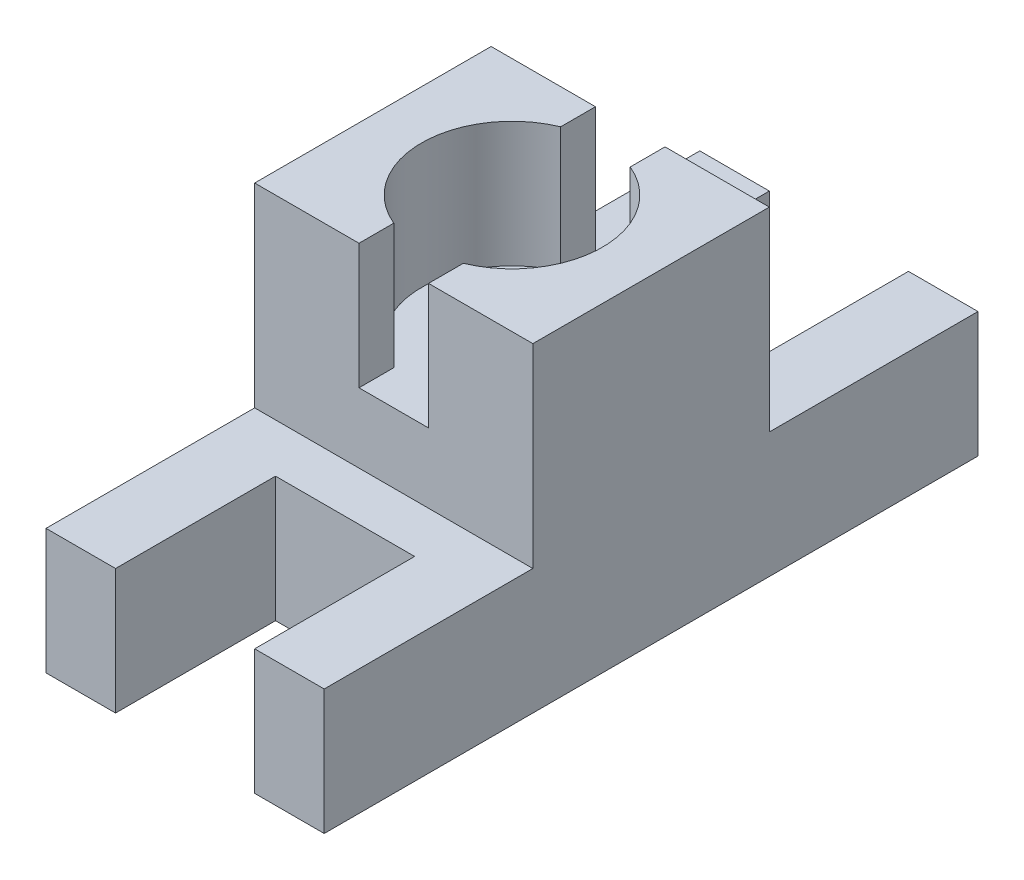
ISO-10303-21;
HEADER;
FILE_DESCRIPTION(('STEP AP214'),'2;1');
FILE_NAME('part.step','',(''),(''),'','','');
FILE_SCHEMA(('AUTOMOTIVE_DESIGN { 1 0 10303 214 1 1 1 1 }'));
ENDSEC;
DATA;
#1=APPLICATION_CONTEXT('core data for automotive mechanical design processes');
#2=APPLICATION_PROTOCOL_DEFINITION('international standard','automotive_design',2000,#1);
#3=PRODUCT_CONTEXT('',#1,'mechanical');
#4=PRODUCT('Part','Part','',(#3));
#5=PRODUCT_RELATED_PRODUCT_CATEGORY('part','',(#4));
#6=PRODUCT_DEFINITION_FORMATION('','',#4);
#7=PRODUCT_DEFINITION_CONTEXT('part definition',#1,'design');
#8=PRODUCT_DEFINITION('design','',#6,#7);
#9=PRODUCT_DEFINITION_SHAPE('','',#8);
#10=(LENGTH_UNIT() NAMED_UNIT(*) SI_UNIT(.MILLI.,.METRE.));
#11=(NAMED_UNIT(*) PLANE_ANGLE_UNIT() SI_UNIT($,.RADIAN.));
#12=(NAMED_UNIT(*) SI_UNIT($,.STERADIAN.) SOLID_ANGLE_UNIT());
#13=UNCERTAINTY_MEASURE_WITH_UNIT(LENGTH_MEASURE(1.E-05),#10,'distance_accuracy_value','');
#14=(GEOMETRIC_REPRESENTATION_CONTEXT(3) GLOBAL_UNCERTAINTY_ASSIGNED_CONTEXT((#13)) GLOBAL_UNIT_ASSIGNED_CONTEXT((#10,
#11,#12)) REPRESENTATION_CONTEXT('',''));
#15=CARTESIAN_POINT('',(0.,0.,0.));
#16=DIRECTION('',(0.,0.,1.));
#17=DIRECTION('',(1.,0.,0.));
#18=AXIS2_PLACEMENT_3D('',#15,#16,#17);
#19=CARTESIAN_POINT('',(-40.,37.,17.));
#20=DIRECTION('',(0.,1.,0.));
#21=DIRECTION('',(0.,0.,1.));
#22=AXIS2_PLACEMENT_3D('',#19,#20,#21);
#23=PLANE('',#22);
#24=DIRECTION('',(0.,0.,-1.));
#25=VECTOR('',#24,1.);
#26=CARTESIAN_POINT('',(-15.,37.,-17.));
#27=LINE('',#26,#25);
#28=CARTESIAN_POINT('',(-15.,37.,-12.));
#29=VERTEX_POINT('',#28);
#30=CARTESIAN_POINT('',(-15.,37.,-17.));
#31=VERTEX_POINT('',#30);
#32=EDGE_CURVE('E226',#29,#31,#27,.T.);
#33=ORIENTED_EDGE('',*,*,#32,.F.);
#34=CARTESIAN_POINT('',(-20.,37.,0.));
#35=DIRECTION('',(0.,1.,0.));
#36=DIRECTION('',(0.,0.,1.));
#37=AXIS2_PLACEMENT_3D('',#34,#35,#36);
#38=CIRCLE('',#37,13.);
#39=CARTESIAN_POINT('',(-15.,37.,12.));
#40=VERTEX_POINT('',#39);
#41=EDGE_CURVE('E228',#40,#29,#38,.T.);
#42=ORIENTED_EDGE('',*,*,#41,.F.);
#43=DIRECTION('',(0.,0.,-1.));
#44=VECTOR('',#43,1.);
#45=CARTESIAN_POINT('',(-15.,37.,12.));
#46=LINE('',#45,#44);
#47=CARTESIAN_POINT('',(-15.,37.,17.));
#48=VERTEX_POINT('',#47);
#49=EDGE_CURVE('E247',#48,#40,#46,.T.);
#50=ORIENTED_EDGE('',*,*,#49,.F.);
#51=DIRECTION('',(1.,0.,0.));
#52=VECTOR('',#51,1.);
#53=CARTESIAN_POINT('',(-40.,37.,17.));
#54=LINE('',#53,#52);
#55=CARTESIAN_POINT('',(0.,37.,17.));
#56=VERTEX_POINT('',#55);
#57=EDGE_CURVE('E371',#48,#56,#54,.T.);
#58=ORIENTED_EDGE('',*,*,#57,.T.);
#59=DIRECTION('',(0.,0.,1.));
#60=VECTOR('',#59,1.);
#61=CARTESIAN_POINT('',(0.,37.,17.));
#62=LINE('',#61,#60);
#63=CARTESIAN_POINT('',(0.,37.,-17.));
#64=VERTEX_POINT('',#63);
#65=EDGE_CURVE('E358',#64,#56,#62,.T.);
#66=ORIENTED_EDGE('',*,*,#65,.F.);
#67=DIRECTION('',(1.,0.,0.));
#68=VECTOR('',#67,1.);
#69=CARTESIAN_POINT('',(-40.,37.,-17.));
#70=LINE('',#69,#68);
#71=EDGE_CURVE('E375',#31,#64,#70,.T.);
#72=ORIENTED_EDGE('',*,*,#71,.F.);
#73=EDGE_LOOP('',(#33,#42,#50,#58,#66,#72));
#74=FACE_BOUND('',#73,.T.);
#75=ADVANCED_FACE('F39',(#74),#23,.T.);
#76=CARTESIAN_POINT('',(-40.,9.,47.));
#77=DIRECTION('',(0.,0.,1.));
#78=DIRECTION('',(1.,0.,0.));
#79=AXIS2_PLACEMENT_3D('',#76,#77,#78);
#80=PLANE('',#79);
#81=DIRECTION('',(0.,1.,0.));
#82=VECTOR('',#81,1.);
#83=CARTESIAN_POINT('',(-9.99999999999999,-9.00000000000001,47.));
#84=LINE('',#83,#82);
#85=CARTESIAN_POINT('',(-9.99999999999999,-9.00000000000001,47.));
#86=VERTEX_POINT('',#85);
#87=CARTESIAN_POINT('',(-9.99999999999999,9.,47.));
#88=VERTEX_POINT('',#87);
#89=EDGE_CURVE('E254',#86,#88,#84,.T.);
#90=ORIENTED_EDGE('',*,*,#89,.F.);
#91=DIRECTION('',(1.,0.,0.));
#92=VECTOR('',#91,1.);
#93=CARTESIAN_POINT('',(-40.,-9.,47.));
#94=LINE('',#93,#92);
#95=CARTESIAN_POINT('',(0.,-9.,47.));
#96=VERTEX_POINT('',#95);
#97=EDGE_CURVE('E343',#86,#96,#94,.T.);
#98=ORIENTED_EDGE('',*,*,#97,.T.);
#99=DIRECTION('',(0.,-1.,0.));
#100=VECTOR('',#99,1.);
#101=CARTESIAN_POINT('',(0.,9.,47.));
#102=LINE('',#101,#100);
#103=CARTESIAN_POINT('',(0.,9.,47.));
#104=VERTEX_POINT('',#103);
#105=EDGE_CURVE('E287',#104,#96,#102,.T.);
#106=ORIENTED_EDGE('',*,*,#105,.F.);
#107=DIRECTION('',(1.,0.,0.));
#108=VECTOR('',#107,1.);
#109=CARTESIAN_POINT('',(-40.,9.,47.));
#110=LINE('',#109,#108);
#111=EDGE_CURVE('E48',#88,#104,#110,.T.);
#112=ORIENTED_EDGE('',*,*,#111,.F.);
#113=EDGE_LOOP('',(#90,#98,#106,#112));
#114=FACE_BOUND('',#113,.T.);
#115=ADVANCED_FACE('F394',(#114),#80,.T.);
#116=CARTESIAN_POINT('',(-40.,9.,-47.));
#117=DIRECTION('',(0.,0.,-1.));
#118=DIRECTION('',(-1.,0.,0.));
#119=AXIS2_PLACEMENT_3D('',#116,#117,#118);
#120=PLANE('',#119);
#121=DIRECTION('',(0.,1.,0.));
#122=VECTOR('',#121,1.);
#123=CARTESIAN_POINT('',(-10.,-9.,-47.));
#124=LINE('',#123,#122);
#125=CARTESIAN_POINT('',(-10.,-9.,-47.));
#126=VERTEX_POINT('',#125);
#127=CARTESIAN_POINT('',(-10.,9.00000000000001,-47.));
#128=VERTEX_POINT('',#127);
#129=EDGE_CURVE('E276',#126,#128,#124,.T.);
#130=ORIENTED_EDGE('',*,*,#129,.T.);
#131=DIRECTION('',(1.,0.,0.));
#132=VECTOR('',#131,1.);
#133=CARTESIAN_POINT('',(-40.,9.,-47.));
#134=LINE('',#133,#132);
#135=CARTESIAN_POINT('',(0.,9.,-47.));
#136=VERTEX_POINT('',#135);
#137=EDGE_CURVE('E380',#128,#136,#134,.T.);
#138=ORIENTED_EDGE('',*,*,#137,.T.);
#139=DIRECTION('',(0.,1.,0.));
#140=VECTOR('',#139,1.);
#141=CARTESIAN_POINT('',(0.,9.,-47.));
#142=LINE('',#141,#140);
#143=CARTESIAN_POINT('',(0.,-9.,-47.));
#144=VERTEX_POINT('',#143);
#145=EDGE_CURVE('E349',#144,#136,#142,.T.);
#146=ORIENTED_EDGE('',*,*,#145,.F.);
#147=DIRECTION('',(1.,0.,0.));
#148=VECTOR('',#147,1.);
#149=CARTESIAN_POINT('',(-40.,-9.,-47.));
#150=LINE('',#149,#148);
#151=EDGE_CURVE('E383',#126,#144,#150,.T.);
#152=ORIENTED_EDGE('',*,*,#151,.F.);
#153=EDGE_LOOP('',(#130,#138,#146,#152));
#154=FACE_BOUND('',#153,.T.);
#155=ADVANCED_FACE('F439',(#154),#120,.T.);
#156=DIRECTION('',(0.,1.,0.));
#157=VECTOR('',#156,1.);
#158=CARTESIAN_POINT('',(-30.,-9.00000000000001,47.));
#159=LINE('',#158,#157);
#160=CARTESIAN_POINT('',(-30.,-9.00000000000001,47.));
#161=VERTEX_POINT('',#160);
#162=CARTESIAN_POINT('',(-30.,9.,47.));
#163=VERTEX_POINT('',#162);
#164=EDGE_CURVE('E299',#161,#163,#159,.T.);
#165=ORIENTED_EDGE('',*,*,#164,.T.);
#166=CARTESIAN_POINT('',(-40.,9.,47.));
#167=VERTEX_POINT('',#166);
#168=EDGE_CURVE('E11',#167,#163,#110,.T.);
#169=ORIENTED_EDGE('',*,*,#168,.F.);
#170=DIRECTION('',(0.,-1.,0.));
#171=VECTOR('',#170,1.);
#172=CARTESIAN_POINT('',(-40.,9.,47.));
#173=LINE('',#172,#171);
#174=CARTESIAN_POINT('',(-40.,-9.,47.));
#175=VERTEX_POINT('',#174);
#176=EDGE_CURVE('E318',#167,#175,#173,.T.);
#177=ORIENTED_EDGE('',*,*,#176,.T.);
#178=EDGE_CURVE('E43',#175,#161,#94,.T.);
#179=ORIENTED_EDGE('',*,*,#178,.T.);
#180=EDGE_LOOP('',(#165,#169,#177,#179));
#181=FACE_BOUND('',#180,.T.);
#182=ADVANCED_FACE('F41',(#181),#80,.T.);
#183=CARTESIAN_POINT('',(-40.,9.,47.));
#184=DIRECTION('',(0.,1.,0.));
#185=DIRECTION('',(0.,0.,1.));
#186=AXIS2_PLACEMENT_3D('',#183,#184,#185);
#187=PLANE('',#186);
#188=DIRECTION('',(0.,0.,-1.));
#189=VECTOR('',#188,1.);
#190=CARTESIAN_POINT('',(-9.99999999999999,9.,47.));
#191=LINE('',#190,#189);
#192=CARTESIAN_POINT('',(-9.99999999999998,9.,24.));
#193=VERTEX_POINT('',#192);
#194=EDGE_CURVE('E280',#88,#193,#191,.T.);
#195=ORIENTED_EDGE('',*,*,#194,.F.);
#196=ORIENTED_EDGE('',*,*,#111,.T.);
#197=DIRECTION('',(0.,0.,1.));
#198=VECTOR('',#197,1.);
#199=CARTESIAN_POINT('',(0.,9.,47.));
#200=LINE('',#199,#198);
#201=CARTESIAN_POINT('',(0.,9.,17.));
#202=VERTEX_POINT('',#201);
#203=EDGE_CURVE('E322',#202,#104,#200,.T.);
#204=ORIENTED_EDGE('',*,*,#203,.F.);
#205=DIRECTION('',(1.,0.,0.));
#206=VECTOR('',#205,1.);
#207=CARTESIAN_POINT('',(-40.,9.,17.));
#208=LINE('',#207,#206);
#209=CARTESIAN_POINT('',(-40.,9.,17.));
#210=VERTEX_POINT('',#209);
#211=EDGE_CURVE('E366',#210,#202,#208,.T.);
#212=ORIENTED_EDGE('',*,*,#211,.F.);
#213=DIRECTION('',(0.,0.,1.));
#214=VECTOR('',#213,1.);
#215=CARTESIAN_POINT('',(-40.,9.,47.));
#216=LINE('',#215,#214);
#217=EDGE_CURVE('E340',#210,#167,#216,.T.);
#218=ORIENTED_EDGE('',*,*,#217,.T.);
#219=ORIENTED_EDGE('',*,*,#168,.T.);
#220=DIRECTION('',(0.,0.,1.));
#221=VECTOR('',#220,1.);
#222=CARTESIAN_POINT('',(-30.,9.,47.));
#223=LINE('',#222,#221);
#224=CARTESIAN_POINT('',(-30.,9.,24.));
#225=VERTEX_POINT('',#224);
#226=EDGE_CURVE('E303',#225,#163,#223,.T.);
#227=ORIENTED_EDGE('',*,*,#226,.F.);
#228=DIRECTION('',(-1.,0.,0.));
#229=VECTOR('',#228,1.);
#230=CARTESIAN_POINT('',(-9.99999999999998,9.,24.));
#231=LINE('',#230,#229);
#232=EDGE_CURVE('E305',#193,#225,#231,.T.);
#233=ORIENTED_EDGE('',*,*,#232,.F.);
#234=EDGE_LOOP('',(#195,#196,#204,#212,#218,#219,#227,#233));
#235=FACE_BOUND('',#234,.T.);
#236=ADVANCED_FACE('F403',(#235),#187,.T.);
#237=CARTESIAN_POINT('',(-40.,37.,17.));
#238=DIRECTION('',(0.,0.,1.));
#239=DIRECTION('',(0.,-1.,0.));
#240=AXIS2_PLACEMENT_3D('',#237,#238,#239);
#241=PLANE('',#240);
#242=DIRECTION('',(0.,1.,0.));
#243=VECTOR('',#242,1.);
#244=CARTESIAN_POINT('',(-15.,19.,17.));
#245=LINE('',#244,#243);
#246=CARTESIAN_POINT('',(-15.,19.,17.));
#247=VERTEX_POINT('',#246);
#248=EDGE_CURVE('E262',#247,#48,#245,.T.);
#249=ORIENTED_EDGE('',*,*,#248,.F.);
#250=DIRECTION('',(1.,0.,0.));
#251=VECTOR('',#250,1.);
#252=CARTESIAN_POINT('',(-25.,19.,17.));
#253=LINE('',#252,#251);
#254=CARTESIAN_POINT('',(-25.,19.,17.));
#255=VERTEX_POINT('',#254);
#256=EDGE_CURVE('E232',#255,#247,#253,.T.);
#257=ORIENTED_EDGE('',*,*,#256,.F.);
#258=DIRECTION('',(0.,1.,0.));
#259=VECTOR('',#258,1.);
#260=CARTESIAN_POINT('',(-25.,19.,17.));
#261=LINE('',#260,#259);
#262=CARTESIAN_POINT('',(-25.,37.,17.));
#263=VERTEX_POINT('',#262);
#264=EDGE_CURVE('E264',#255,#263,#261,.T.);
#265=ORIENTED_EDGE('',*,*,#264,.T.);
#266=CARTESIAN_POINT('',(-40.,37.,17.));
#267=VERTEX_POINT('',#266);
#268=EDGE_CURVE('E368',#267,#263,#54,.T.);
#269=ORIENTED_EDGE('',*,*,#268,.F.);
#270=DIRECTION('',(0.,-1.,0.));
#271=VECTOR('',#270,1.);
#272=CARTESIAN_POINT('',(-40.,37.,17.));
#273=LINE('',#272,#271);
#274=EDGE_CURVE('E337',#267,#210,#273,.T.);
#275=ORIENTED_EDGE('',*,*,#274,.T.);
#276=ORIENTED_EDGE('',*,*,#211,.T.);
#277=DIRECTION('',(0.,-1.,0.));
#278=VECTOR('',#277,1.);
#279=CARTESIAN_POINT('',(0.,37.,17.));
#280=LINE('',#279,#278);
#281=EDGE_CURVE('E361',#56,#202,#280,.T.);
#282=ORIENTED_EDGE('',*,*,#281,.F.);
#283=ORIENTED_EDGE('',*,*,#57,.F.);
#284=EDGE_LOOP('',(#249,#257,#265,#269,#275,#276,#282,#283));
#285=FACE_BOUND('',#284,.T.);
#286=ADVANCED_FACE('F453',(#285),#241,.T.);
#287=DIRECTION('',(0.,0.,1.));
#288=VECTOR('',#287,1.);
#289=CARTESIAN_POINT('',(-25.,37.,-17.));
#290=LINE('',#289,#288);
#291=CARTESIAN_POINT('',(-25.,37.,-17.));
#292=VERTEX_POINT('',#291);
#293=CARTESIAN_POINT('',(-25.,37.,-12.));
#294=VERTEX_POINT('',#293);
#295=EDGE_CURVE('E209',#292,#294,#290,.T.);
#296=ORIENTED_EDGE('',*,*,#295,.F.);
#297=CARTESIAN_POINT('',(-40.,37.,-17.));
#298=VERTEX_POINT('',#297);
#299=EDGE_CURVE('E372',#298,#292,#70,.T.);
#300=ORIENTED_EDGE('',*,*,#299,.F.);
#301=DIRECTION('',(0.,0.,1.));
#302=VECTOR('',#301,1.);
#303=CARTESIAN_POINT('',(-40.,37.,17.));
#304=LINE('',#303,#302);
#305=EDGE_CURVE('E334',#298,#267,#304,.T.);
#306=ORIENTED_EDGE('',*,*,#305,.T.);
#307=ORIENTED_EDGE('',*,*,#268,.T.);
#308=DIRECTION('',(0.,0.,1.));
#309=VECTOR('',#308,1.);
#310=CARTESIAN_POINT('',(-25.,37.,12.));
#311=LINE('',#310,#309);
#312=CARTESIAN_POINT('',(-25.,37.,12.));
#313=VERTEX_POINT('',#312);
#314=EDGE_CURVE('E245',#313,#263,#311,.T.);
#315=ORIENTED_EDGE('',*,*,#314,.F.);
#316=CARTESIAN_POINT('',(-20.,37.,0.));
#317=DIRECTION('',(0.,1.,0.));
#318=DIRECTION('',(0.,0.,1.));
#319=AXIS2_PLACEMENT_3D('',#316,#317,#318);
#320=CIRCLE('',#319,13.);
#321=EDGE_CURVE('E243',#294,#313,#320,.T.);
#322=ORIENTED_EDGE('',*,*,#321,.F.);
#323=EDGE_LOOP('',(#296,#300,#306,#307,#315,#322));
#324=FACE_BOUND('',#323,.T.);
#325=ADVANCED_FACE('F457',(#324),#23,.T.);
#326=CARTESIAN_POINT('',(-40.,37.,-17.));
#327=DIRECTION('',(0.,0.,-1.));
#328=DIRECTION('',(0.,1.,0.));
#329=AXIS2_PLACEMENT_3D('',#326,#327,#328);
#330=PLANE('',#329);
#331=DIRECTION('',(0.,1.,0.));
#332=VECTOR('',#331,1.);
#333=CARTESIAN_POINT('',(-25.,19.,-17.));
#334=LINE('',#333,#332);
#335=CARTESIAN_POINT('',(-25.,19.,-17.));
#336=VERTEX_POINT('',#335);
#337=EDGE_CURVE('E252',#336,#292,#334,.T.);
#338=ORIENTED_EDGE('',*,*,#337,.F.);
#339=DIRECTION('',(-1.,0.,0.));
#340=VECTOR('',#339,1.);
#341=CARTESIAN_POINT('',(-25.,19.,-17.));
#342=LINE('',#341,#340);
#343=CARTESIAN_POINT('',(-15.,19.,-17.));
#344=VERTEX_POINT('',#343);
#345=EDGE_CURVE('E214',#344,#336,#342,.T.);
#346=ORIENTED_EDGE('',*,*,#345,.F.);
#347=DIRECTION('',(0.,1.,0.));
#348=VECTOR('',#347,1.);
#349=CARTESIAN_POINT('',(-15.,19.,-17.));
#350=LINE('',#349,#348);
#351=EDGE_CURVE('E255',#344,#31,#350,.T.);
#352=ORIENTED_EDGE('',*,*,#351,.T.);
#353=ORIENTED_EDGE('',*,*,#71,.T.);
#354=DIRECTION('',(0.,1.,0.));
#355=VECTOR('',#354,1.);
#356=CARTESIAN_POINT('',(0.,37.,-17.));
#357=LINE('',#356,#355);
#358=CARTESIAN_POINT('',(0.,9.,-17.));
#359=VERTEX_POINT('',#358);
#360=EDGE_CURVE('E355',#359,#64,#357,.T.);
#361=ORIENTED_EDGE('',*,*,#360,.F.);
#362=DIRECTION('',(1.,0.,0.));
#363=VECTOR('',#362,1.);
#364=CARTESIAN_POINT('',(-40.,9.,-17.));
#365=LINE('',#364,#363);
#366=CARTESIAN_POINT('',(-40.,9.,-17.));
#367=VERTEX_POINT('',#366);
#368=EDGE_CURVE('E376',#367,#359,#365,.T.);
#369=ORIENTED_EDGE('',*,*,#368,.F.);
#370=DIRECTION('',(0.,1.,0.));
#371=VECTOR('',#370,1.);
#372=CARTESIAN_POINT('',(-40.,37.,-17.));
#373=LINE('',#372,#371);
#374=EDGE_CURVE('E331',#367,#298,#373,.T.);
#375=ORIENTED_EDGE('',*,*,#374,.T.);
#376=ORIENTED_EDGE('',*,*,#299,.T.);
#377=EDGE_LOOP('',(#338,#346,#352,#353,#361,#369,#375,#376));
#378=FACE_BOUND('',#377,.T.);
#379=ADVANCED_FACE('F443',(#378),#330,.T.);
#380=CARTESIAN_POINT('',(-40.,9.,-17.));
#381=DIRECTION('',(0.,1.,0.));
#382=DIRECTION('',(0.,0.,1.));
#383=AXIS2_PLACEMENT_3D('',#380,#381,#382);
#384=PLANE('',#383);
#385=DIRECTION('',(0.,0.,-1.));
#386=VECTOR('',#385,1.);
#387=CARTESIAN_POINT('',(-10.,9.00000000000001,-47.));
#388=LINE('',#387,#386);
#389=CARTESIAN_POINT('',(-10.,9.00000000000001,-24.));
#390=VERTEX_POINT('',#389);
#391=EDGE_CURVE('E277',#390,#128,#388,.T.);
#392=ORIENTED_EDGE('',*,*,#391,.F.);
#393=DIRECTION('',(1.,0.,0.));
#394=VECTOR('',#393,1.);
#395=CARTESIAN_POINT('',(-10.,9.00000000000001,-24.));
#396=LINE('',#395,#394);
#397=CARTESIAN_POINT('',(-30.,9.00000000000001,-24.));
#398=VERTEX_POINT('',#397);
#399=EDGE_CURVE('E272',#398,#390,#396,.T.);
#400=ORIENTED_EDGE('',*,*,#399,.F.);
#401=DIRECTION('',(0.,0.,1.));
#402=VECTOR('',#401,1.);
#403=CARTESIAN_POINT('',(-30.,9.00000000000001,-47.));
#404=LINE('',#403,#402);
#405=CARTESIAN_POINT('',(-30.,9.00000000000001,-47.));
#406=VERTEX_POINT('',#405);
#407=EDGE_CURVE('E279',#406,#398,#404,.T.);
#408=ORIENTED_EDGE('',*,*,#407,.F.);
#409=CARTESIAN_POINT('',(-40.,9.,-47.));
#410=VERTEX_POINT('',#409);
#411=EDGE_CURVE('E378',#410,#406,#134,.T.);
#412=ORIENTED_EDGE('',*,*,#411,.F.);
#413=DIRECTION('',(0.,0.,1.));
#414=VECTOR('',#413,1.);
#415=CARTESIAN_POINT('',(-40.,9.,-17.));
#416=LINE('',#415,#414);
#417=EDGE_CURVE('E328',#410,#367,#416,.T.);
#418=ORIENTED_EDGE('',*,*,#417,.T.);
#419=ORIENTED_EDGE('',*,*,#368,.T.);
#420=DIRECTION('',(0.,0.,1.));
#421=VECTOR('',#420,1.);
#422=CARTESIAN_POINT('',(0.,9.,-17.));
#423=LINE('',#422,#421);
#424=EDGE_CURVE('E352',#136,#359,#423,.T.);
#425=ORIENTED_EDGE('',*,*,#424,.F.);
#426=ORIENTED_EDGE('',*,*,#137,.F.);
#427=EDGE_LOOP('',(#392,#400,#408,#412,#418,#419,#425,#426));
#428=FACE_BOUND('',#427,.T.);
#429=ADVANCED_FACE('F433',(#428),#384,.T.);
#430=DIRECTION('',(0.,1.,0.));
#431=VECTOR('',#430,1.);
#432=CARTESIAN_POINT('',(-30.,-9.,-47.));
#433=LINE('',#432,#431);
#434=CARTESIAN_POINT('',(-30.,-9.,-47.));
#435=VERTEX_POINT('',#434);
#436=EDGE_CURVE('E290',#435,#406,#433,.T.);
#437=ORIENTED_EDGE('',*,*,#436,.F.);
#438=CARTESIAN_POINT('',(-40.,-9.,-47.));
#439=VERTEX_POINT('',#438);
#440=EDGE_CURVE('E381',#439,#435,#150,.T.);
#441=ORIENTED_EDGE('',*,*,#440,.F.);
#442=DIRECTION('',(0.,1.,0.));
#443=VECTOR('',#442,1.);
#444=CARTESIAN_POINT('',(-40.,9.,-47.));
#445=LINE('',#444,#443);
#446=EDGE_CURVE('E325',#439,#410,#445,.T.);
#447=ORIENTED_EDGE('',*,*,#446,.T.);
#448=ORIENTED_EDGE('',*,*,#411,.T.);
#449=EDGE_LOOP('',(#437,#441,#447,#448));
#450=FACE_BOUND('',#449,.T.);
#451=ADVANCED_FACE('F426',(#450),#120,.T.);
#452=CARTESIAN_POINT('',(-40.,-9.,47.));
#453=DIRECTION('',(0.,-1.,0.));
#454=DIRECTION('',(0.,0.,-1.));
#455=AXIS2_PLACEMENT_3D('',#452,#453,#454);
#456=PLANE('',#455);
#457=DIRECTION('',(0.,0.,-1.));
#458=VECTOR('',#457,1.);
#459=CARTESIAN_POINT('',(-10.,-9.,-47.));
#460=LINE('',#459,#458);
#461=CARTESIAN_POINT('',(-10.,-9.,-24.));
#462=VERTEX_POINT('',#461);
#463=EDGE_CURVE('E268',#462,#126,#460,.T.);
#464=ORIENTED_EDGE('',*,*,#463,.T.);
#465=ORIENTED_EDGE('',*,*,#151,.T.);
#466=DIRECTION('',(0.,0.,-1.));
#467=VECTOR('',#466,1.);
#468=CARTESIAN_POINT('',(0.,-9.,47.));
#469=LINE('',#468,#467);
#470=EDGE_CURVE('E346',#96,#144,#469,.T.);
#471=ORIENTED_EDGE('',*,*,#470,.F.);
#472=ORIENTED_EDGE('',*,*,#97,.F.);
#473=DIRECTION('',(0.,0.,-1.));
#474=VECTOR('',#473,1.);
#475=CARTESIAN_POINT('',(-9.99999999999999,-9.00000000000001,47.));
#476=LINE('',#475,#474);
#477=CARTESIAN_POINT('',(-9.99999999999998,-9.00000000000001,24.));
#478=VERTEX_POINT('',#477);
#479=EDGE_CURVE('E306',#86,#478,#476,.T.);
#480=ORIENTED_EDGE('',*,*,#479,.T.);
#481=DIRECTION('',(-1.,0.,0.));
#482=VECTOR('',#481,1.);
#483=CARTESIAN_POINT('',(-9.99999999999998,-9.00000000000001,24.));
#484=LINE('',#483,#482);
#485=CARTESIAN_POINT('',(-30.,-9.,24.));
#486=VERTEX_POINT('',#485);
#487=EDGE_CURVE('E313',#478,#486,#484,.T.);
#488=ORIENTED_EDGE('',*,*,#487,.T.);
#489=DIRECTION('',(0.,0.,1.));
#490=VECTOR('',#489,1.);
#491=CARTESIAN_POINT('',(-30.,-9.00000000000001,47.));
#492=LINE('',#491,#490);
#493=EDGE_CURVE('E296',#486,#161,#492,.T.);
#494=ORIENTED_EDGE('',*,*,#493,.T.);
#495=ORIENTED_EDGE('',*,*,#178,.F.);
#496=DIRECTION('',(0.,0.,-1.));
#497=VECTOR('',#496,1.);
#498=CARTESIAN_POINT('',(-40.,-9.,47.));
#499=LINE('',#498,#497);
#500=EDGE_CURVE('E321',#175,#439,#499,.T.);
#501=ORIENTED_EDGE('',*,*,#500,.T.);
#502=ORIENTED_EDGE('',*,*,#440,.T.);
#503=DIRECTION('',(0.,0.,1.));
#504=VECTOR('',#503,1.);
#505=CARTESIAN_POINT('',(-30.,-9.,-47.));
#506=LINE('',#505,#504);
#507=CARTESIAN_POINT('',(-30.,-9.,-24.));
#508=VERTEX_POINT('',#507);
#509=EDGE_CURVE('E271',#435,#508,#506,.T.);
#510=ORIENTED_EDGE('',*,*,#509,.T.);
#511=DIRECTION('',(1.,0.,0.));
#512=VECTOR('',#511,1.);
#513=CARTESIAN_POINT('',(-10.,-9.,-24.));
#514=LINE('',#513,#512);
#515=EDGE_CURVE('E64',#508,#462,#514,.T.);
#516=ORIENTED_EDGE('',*,*,#515,.T.);
#517=EDGE_LOOP('',(#464,#465,#471,#472,#480,#488,#494,#495,#501,#502,#510,#516));
#518=FACE_BOUND('',#517,.T.);
#519=ADVANCED_FACE('F396',(#518),#456,.T.);
#520=CARTESIAN_POINT('',(-40.,0.,0.));
#521=DIRECTION('',(1.,0.,0.));
#522=DIRECTION('',(0.,0.,-1.));
#523=AXIS2_PLACEMENT_3D('',#520,#521,#522);
#524=PLANE('',#523);
#525=ORIENTED_EDGE('',*,*,#176,.F.);
#526=ORIENTED_EDGE('',*,*,#217,.F.);
#527=ORIENTED_EDGE('',*,*,#274,.F.);
#528=ORIENTED_EDGE('',*,*,#305,.F.);
#529=ORIENTED_EDGE('',*,*,#374,.F.);
#530=ORIENTED_EDGE('',*,*,#417,.F.);
#531=ORIENTED_EDGE('',*,*,#446,.F.);
#532=ORIENTED_EDGE('',*,*,#500,.F.);
#533=EDGE_LOOP('',(#525,#526,#527,#528,#529,#530,#531,#532));
#534=FACE_BOUND('',#533,.T.);
#535=ADVANCED_FACE('F418',(#534),#524,.F.);
#536=CARTESIAN_POINT('',(0.,0.,0.));
#537=DIRECTION('',(1.,0.,0.));
#538=DIRECTION('',(0.,0.,-1.));
#539=AXIS2_PLACEMENT_3D('',#536,#537,#538);
#540=PLANE('',#539);
#541=ORIENTED_EDGE('',*,*,#105,.T.);
#542=ORIENTED_EDGE('',*,*,#470,.T.);
#543=ORIENTED_EDGE('',*,*,#145,.T.);
#544=ORIENTED_EDGE('',*,*,#424,.T.);
#545=ORIENTED_EDGE('',*,*,#360,.T.);
#546=ORIENTED_EDGE('',*,*,#65,.T.);
#547=ORIENTED_EDGE('',*,*,#281,.T.);
#548=ORIENTED_EDGE('',*,*,#203,.T.);
#549=EDGE_LOOP('',(#541,#542,#543,#544,#545,#546,#547,#548));
#550=FACE_BOUND('',#549,.T.);
#551=ADVANCED_FACE('F398',(#550),#540,.T.);
#552=CARTESIAN_POINT('',(-9.99999999999999,-9.00000000000001,47.));
#553=DIRECTION('',(1.,0.,0.));
#554=DIRECTION('',(0.,0.,-1.));
#555=AXIS2_PLACEMENT_3D('',#552,#553,#554);
#556=PLANE('',#555);
#557=ORIENTED_EDGE('',*,*,#194,.T.);
#558=DIRECTION('',(0.,1.,0.));
#559=VECTOR('',#558,1.);
#560=CARTESIAN_POINT('',(-9.99999999999998,-9.00000000000001,24.));
#561=LINE('',#560,#559);
#562=EDGE_CURVE('E294',#478,#193,#561,.T.);
#563=ORIENTED_EDGE('',*,*,#562,.F.);
#564=ORIENTED_EDGE('',*,*,#479,.F.);
#565=ORIENTED_EDGE('',*,*,#89,.T.);
#566=EDGE_LOOP('',(#557,#563,#564,#565));
#567=FACE_BOUND('',#566,.T.);
#568=ADVANCED_FACE('F407',(#567),#556,.F.);
#569=CARTESIAN_POINT('',(-30.,-9.00000000000001,47.));
#570=DIRECTION('',(-1.,0.,0.));
#571=DIRECTION('',(0.,0.,1.));
#572=AXIS2_PLACEMENT_3D('',#569,#570,#571);
#573=PLANE('',#572);
#574=ORIENTED_EDGE('',*,*,#226,.T.);
#575=ORIENTED_EDGE('',*,*,#164,.F.);
#576=ORIENTED_EDGE('',*,*,#493,.F.);
#577=DIRECTION('',(0.,1.,0.));
#578=VECTOR('',#577,1.);
#579=CARTESIAN_POINT('',(-30.,-9.00000000000001,24.));
#580=LINE('',#579,#578);
#581=EDGE_CURVE('E297',#486,#225,#580,.T.);
#582=ORIENTED_EDGE('',*,*,#581,.T.);
#583=EDGE_LOOP('',(#574,#575,#576,#582));
#584=FACE_BOUND('',#583,.T.);
#585=ADVANCED_FACE('F413',(#584),#573,.F.);
#586=CARTESIAN_POINT('',(-9.99999999999998,-9.00000000000001,24.));
#587=DIRECTION('',(0.,0.,-1.));
#588=DIRECTION('',(-1.,0.,0.));
#589=AXIS2_PLACEMENT_3D('',#586,#587,#588);
#590=PLANE('',#589);
#591=ORIENTED_EDGE('',*,*,#232,.T.);
#592=ORIENTED_EDGE('',*,*,#581,.F.);
#593=ORIENTED_EDGE('',*,*,#487,.F.);
#594=ORIENTED_EDGE('',*,*,#562,.T.);
#595=EDGE_LOOP('',(#591,#592,#593,#594));
#596=FACE_BOUND('',#595,.T.);
#597=ADVANCED_FACE('F411',(#596),#590,.F.);
#598=CARTESIAN_POINT('',(-10.,-9.,-47.));
#599=DIRECTION('',(1.,0.,0.));
#600=DIRECTION('',(0.,0.,-1.));
#601=AXIS2_PLACEMENT_3D('',#598,#599,#600);
#602=PLANE('',#601);
#603=ORIENTED_EDGE('',*,*,#391,.T.);
#604=ORIENTED_EDGE('',*,*,#129,.F.);
#605=ORIENTED_EDGE('',*,*,#463,.F.);
#606=DIRECTION('',(0.,1.,0.));
#607=VECTOR('',#606,1.);
#608=CARTESIAN_POINT('',(-10.,-9.,-24.));
#609=LINE('',#608,#607);
#610=EDGE_CURVE('E285',#462,#390,#609,.T.);
#611=ORIENTED_EDGE('',*,*,#610,.T.);
#612=EDGE_LOOP('',(#603,#604,#605,#611));
#613=FACE_BOUND('',#612,.T.);
#614=ADVANCED_FACE('F501',(#613),#602,.F.);
#615=CARTESIAN_POINT('',(-10.,-9.,-24.));
#616=DIRECTION('',(0.,0.,1.));
#617=DIRECTION('',(1.,0.,0.));
#618=AXIS2_PLACEMENT_3D('',#615,#616,#617);
#619=PLANE('',#618);
#620=ORIENTED_EDGE('',*,*,#399,.T.);
#621=ORIENTED_EDGE('',*,*,#610,.F.);
#622=ORIENTED_EDGE('',*,*,#515,.F.);
#623=DIRECTION('',(0.,1.,0.));
#624=VECTOR('',#623,1.);
#625=CARTESIAN_POINT('',(-30.,-9.,-24.));
#626=LINE('',#625,#624);
#627=EDGE_CURVE('E288',#508,#398,#626,.T.);
#628=ORIENTED_EDGE('',*,*,#627,.T.);
#629=EDGE_LOOP('',(#620,#621,#622,#628));
#630=FACE_BOUND('',#629,.T.);
#631=ADVANCED_FACE('F435',(#630),#619,.F.);
#632=CARTESIAN_POINT('',(-30.,-9.,-47.));
#633=DIRECTION('',(-1.,0.,0.));
#634=DIRECTION('',(0.,0.,1.));
#635=AXIS2_PLACEMENT_3D('',#632,#633,#634);
#636=PLANE('',#635);
#637=ORIENTED_EDGE('',*,*,#407,.T.);
#638=ORIENTED_EDGE('',*,*,#627,.F.);
#639=ORIENTED_EDGE('',*,*,#509,.F.);
#640=ORIENTED_EDGE('',*,*,#436,.T.);
#641=EDGE_LOOP('',(#637,#638,#639,#640));
#642=FACE_BOUND('',#641,.T.);
#643=ADVANCED_FACE('F429',(#642),#636,.F.);
#644=CARTESIAN_POINT('',(-25.,19.,-17.));
#645=DIRECTION('',(-1.,0.,0.));
#646=DIRECTION('',(0.,0.,1.));
#647=AXIS2_PLACEMENT_3D('',#644,#645,#646);
#648=PLANE('',#647);
#649=ORIENTED_EDGE('',*,*,#295,.T.);
#650=DIRECTION('',(0.,1.,0.));
#651=VECTOR('',#650,1.);
#652=CARTESIAN_POINT('',(-25.,19.,-12.));
#653=LINE('',#652,#651);
#654=CARTESIAN_POINT('',(-25.,19.,-12.));
#655=VERTEX_POINT('',#654);
#656=EDGE_CURVE('E203',#655,#294,#653,.T.);
#657=ORIENTED_EDGE('',*,*,#656,.F.);
#658=DIRECTION('',(0.,0.,1.));
#659=VECTOR('',#658,1.);
#660=CARTESIAN_POINT('',(-25.,19.,-17.));
#661=LINE('',#660,#659);
#662=EDGE_CURVE('E207',#336,#655,#661,.T.);
#663=ORIENTED_EDGE('',*,*,#662,.F.);
#664=ORIENTED_EDGE('',*,*,#337,.T.);
#665=EDGE_LOOP('',(#649,#657,#663,#664));
#666=FACE_BOUND('',#665,.T.);
#667=ADVANCED_FACE('F205',(#666),#648,.F.);
#668=CARTESIAN_POINT('',(-15.,19.,-17.));
#669=DIRECTION('',(1.,0.,0.));
#670=DIRECTION('',(0.,0.,-1.));
#671=AXIS2_PLACEMENT_3D('',#668,#669,#670);
#672=PLANE('',#671);
#673=ORIENTED_EDGE('',*,*,#32,.T.);
#674=ORIENTED_EDGE('',*,*,#351,.F.);
#675=DIRECTION('',(0.,0.,-1.));
#676=VECTOR('',#675,1.);
#677=CARTESIAN_POINT('',(-15.,19.,-17.));
#678=LINE('',#677,#676);
#679=CARTESIAN_POINT('',(-15.,19.,-12.));
#680=VERTEX_POINT('',#679);
#681=EDGE_CURVE('E56',#680,#344,#678,.T.);
#682=ORIENTED_EDGE('',*,*,#681,.F.);
#683=DIRECTION('',(0.,1.,0.));
#684=VECTOR('',#683,1.);
#685=CARTESIAN_POINT('',(-15.,19.,-12.));
#686=LINE('',#685,#684);
#687=EDGE_CURVE('E258',#680,#29,#686,.T.);
#688=ORIENTED_EDGE('',*,*,#687,.T.);
#689=EDGE_LOOP('',(#673,#674,#682,#688));
#690=FACE_BOUND('',#689,.T.);
#691=ADVANCED_FACE('F466',(#690),#672,.F.);
#692=CARTESIAN_POINT('',(-20.,19.,0.));
#693=DIRECTION('',(0.,1.,0.));
#694=DIRECTION('',(0.,0.,1.));
#695=AXIS2_PLACEMENT_3D('',#692,#693,#694);
#696=CYLINDRICAL_SURFACE('',#695,13.);
#697=ORIENTED_EDGE('',*,*,#41,.T.);
#698=ORIENTED_EDGE('',*,*,#687,.F.);
#699=CARTESIAN_POINT('',(-20.,19.,0.));
#700=DIRECTION('',(0.,1.,0.));
#701=DIRECTION('',(0.,0.,1.));
#702=AXIS2_PLACEMENT_3D('',#699,#700,#701);
#703=CIRCLE('',#702,13.);
#704=CARTESIAN_POINT('',(-15.,19.,12.));
#705=VERTEX_POINT('',#704);
#706=EDGE_CURVE('E238',#705,#680,#703,.T.);
#707=ORIENTED_EDGE('',*,*,#706,.F.);
#708=DIRECTION('',(0.,1.,0.));
#709=VECTOR('',#708,1.);
#710=CARTESIAN_POINT('',(-15.,19.,12.));
#711=LINE('',#710,#709);
#712=EDGE_CURVE('E260',#705,#40,#711,.T.);
#713=ORIENTED_EDGE('',*,*,#712,.T.);
#714=EDGE_LOOP('',(#697,#698,#707,#713));
#715=FACE_BOUND('',#714,.T.);
#716=ADVANCED_FACE('F464',(#715),#696,.F.);
#717=CARTESIAN_POINT('',(-15.,19.,12.));
#718=DIRECTION('',(1.,0.,0.));
#719=DIRECTION('',(0.,0.,-1.));
#720=AXIS2_PLACEMENT_3D('',#717,#718,#719);
#721=PLANE('',#720);
#722=ORIENTED_EDGE('',*,*,#49,.T.);
#723=ORIENTED_EDGE('',*,*,#712,.F.);
#724=DIRECTION('',(0.,0.,-1.));
#725=VECTOR('',#724,1.);
#726=CARTESIAN_POINT('',(-15.,19.,12.));
#727=LINE('',#726,#725);
#728=EDGE_CURVE('E235',#247,#705,#727,.T.);
#729=ORIENTED_EDGE('',*,*,#728,.F.);
#730=ORIENTED_EDGE('',*,*,#248,.T.);
#731=EDGE_LOOP('',(#722,#723,#729,#730));
#732=FACE_BOUND('',#731,.T.);
#733=ADVANCED_FACE('F461',(#732),#721,.F.);
#734=CARTESIAN_POINT('',(-25.,19.,12.));
#735=DIRECTION('',(-1.,0.,0.));
#736=DIRECTION('',(0.,0.,1.));
#737=AXIS2_PLACEMENT_3D('',#734,#735,#736);
#738=PLANE('',#737);
#739=ORIENTED_EDGE('',*,*,#314,.T.);
#740=ORIENTED_EDGE('',*,*,#264,.F.);
#741=DIRECTION('',(0.,0.,1.));
#742=VECTOR('',#741,1.);
#743=CARTESIAN_POINT('',(-25.,19.,12.));
#744=LINE('',#743,#742);
#745=CARTESIAN_POINT('',(-25.,19.,12.));
#746=VERTEX_POINT('',#745);
#747=EDGE_CURVE('E221',#746,#255,#744,.T.);
#748=ORIENTED_EDGE('',*,*,#747,.F.);
#749=DIRECTION('',(0.,1.,0.));
#750=VECTOR('',#749,1.);
#751=CARTESIAN_POINT('',(-25.,19.,12.));
#752=LINE('',#751,#750);
#753=EDGE_CURVE('E213',#746,#313,#752,.T.);
#754=ORIENTED_EDGE('',*,*,#753,.T.);
#755=EDGE_LOOP('',(#739,#740,#748,#754));
#756=FACE_BOUND('',#755,.T.);
#757=ADVANCED_FACE('F459',(#756),#738,.F.);
#758=CARTESIAN_POINT('',(-20.,19.,0.));
#759=DIRECTION('',(0.,1.,0.));
#760=DIRECTION('',(0.,0.,1.));
#761=AXIS2_PLACEMENT_3D('',#758,#759,#760);
#762=CYLINDRICAL_SURFACE('',#761,13.);
#763=ORIENTED_EDGE('',*,*,#321,.T.);
#764=ORIENTED_EDGE('',*,*,#753,.F.);
#765=CARTESIAN_POINT('',(-20.,19.,0.));
#766=DIRECTION('',(0.,1.,0.));
#767=DIRECTION('',(0.,0.,1.));
#768=AXIS2_PLACEMENT_3D('',#765,#766,#767);
#769=CIRCLE('',#768,13.);
#770=EDGE_CURVE('E217',#655,#746,#769,.T.);
#771=ORIENTED_EDGE('',*,*,#770,.F.);
#772=ORIENTED_EDGE('',*,*,#656,.T.);
#773=EDGE_LOOP('',(#763,#764,#771,#772));
#774=FACE_BOUND('',#773,.T.);
#775=ADVANCED_FACE('F218',(#774),#762,.F.);
#776=CARTESIAN_POINT('',(-20.,19.,0.));
#777=DIRECTION('',(0.,1.,0.));
#778=DIRECTION('',(0.,0.,1.));
#779=AXIS2_PLACEMENT_3D('',#776,#777,#778);
#780=PLANE('',#779);
#781=ORIENTED_EDGE('',*,*,#662,.T.);
#782=ORIENTED_EDGE('',*,*,#770,.T.);
#783=ORIENTED_EDGE('',*,*,#747,.T.);
#784=ORIENTED_EDGE('',*,*,#256,.T.);
#785=ORIENTED_EDGE('',*,*,#728,.T.);
#786=ORIENTED_EDGE('',*,*,#706,.T.);
#787=ORIENTED_EDGE('',*,*,#681,.T.);
#788=ORIENTED_EDGE('',*,*,#345,.T.);
#789=EDGE_LOOP('',(#781,#782,#783,#784,#785,#786,#787,#788));
#790=FACE_BOUND('',#789,.T.);
#791=ADVANCED_FACE('F223',(#790),#780,.T.);
#792=CLOSED_SHELL('',(#75,#115,#155,#182,#236,#286,#325,#379,#429,#451,#519,#535,#551,#568,#585,
#597,#614,#631,#643,#667,#691,#716,#733,#757,#775,#791));
#793=MANIFOLD_SOLID_BREP('B2',#792);
#794=ADVANCED_BREP_SHAPE_REPRESENTATION('',(#18,#793),#14);
#795=SHAPE_DEFINITION_REPRESENTATION(#9,#794);
ENDSEC;
END-ISO-10303-21;
